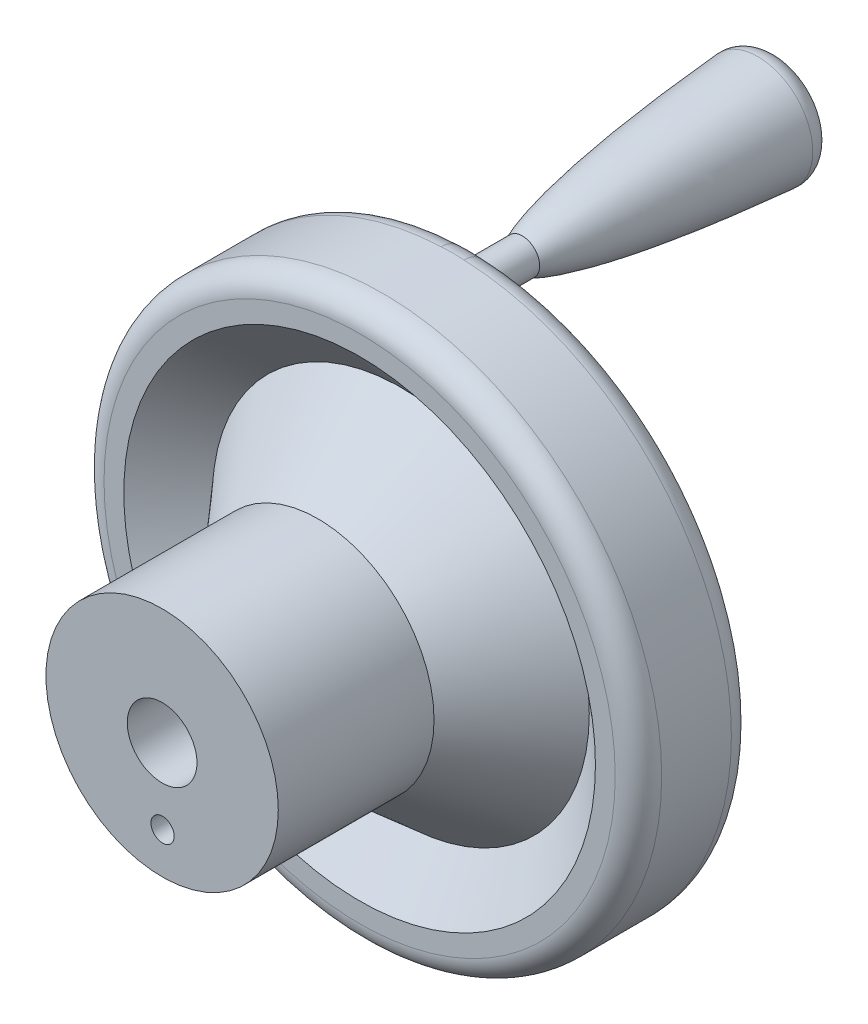
ISO-10303-21;
HEADER;
FILE_DESCRIPTION(('STEP AP214'),'2;1');
FILE_NAME('part.step','',(''),(''),'','','');
FILE_SCHEMA(('AUTOMOTIVE_DESIGN { 1 0 10303 214 1 1 1 1 }'));
ENDSEC;
DATA;
#1=APPLICATION_CONTEXT('core data for automotive mechanical design processes');
#2=APPLICATION_PROTOCOL_DEFINITION('international standard','automotive_design',2000,#1);
#3=PRODUCT_CONTEXT('',#1,'mechanical');
#4=PRODUCT('Part','Part','',(#3));
#5=PRODUCT_RELATED_PRODUCT_CATEGORY('part','',(#4));
#6=PRODUCT_DEFINITION_FORMATION('','',#4);
#7=PRODUCT_DEFINITION_CONTEXT('part definition',#1,'design');
#8=PRODUCT_DEFINITION('design','',#6,#7);
#9=PRODUCT_DEFINITION_SHAPE('','',#8);
#10=(LENGTH_UNIT() NAMED_UNIT(*) SI_UNIT(.MILLI.,.METRE.));
#11=(NAMED_UNIT(*) PLANE_ANGLE_UNIT() SI_UNIT($,.RADIAN.));
#12=(NAMED_UNIT(*) SI_UNIT($,.STERADIAN.) SOLID_ANGLE_UNIT());
#13=UNCERTAINTY_MEASURE_WITH_UNIT(LENGTH_MEASURE(1.E-05),#10,'distance_accuracy_value','');
#14=(GEOMETRIC_REPRESENTATION_CONTEXT(3) GLOBAL_UNCERTAINTY_ASSIGNED_CONTEXT((#13)) GLOBAL_UNIT_ASSIGNED_CONTEXT((#10,
#11,#12)) REPRESENTATION_CONTEXT('',''));
#15=CARTESIAN_POINT('',(0.,0.,0.));
#16=DIRECTION('',(0.,0.,1.));
#17=DIRECTION('',(1.,0.,0.));
#18=AXIS2_PLACEMENT_3D('',#15,#16,#17);
#19=CARTESIAN_POINT('',(0.,0.,-42.8625));
#20=DIRECTION('',(0.,0.,1.));
#21=DIRECTION('',(1.,0.,0.));
#22=AXIS2_PLACEMENT_3D('',#19,#20,#21);
#23=PLANE('',#22);
#24=CARTESIAN_POINT('',(0.,15.875,-42.8625));
#25=DIRECTION('',(0.,0.,1.));
#26=DIRECTION('',(1.,0.,0.));
#27=AXIS2_PLACEMENT_3D('',#24,#25,#26);
#28=CIRCLE('',#27,26.2316229134082);
#29=CARTESIAN_POINT('',(26.2316229134082,15.875,-42.8625));
#30=VERTEX_POINT('',#29);
#31=EDGE_CURVE('E155',#30,#30,#28,.T.);
#32=ORIENTED_EDGE('',*,*,#31,.T.);
#33=EDGE_LOOP('',(#32));
#34=FACE_BOUND('',#33,.T.);
#35=CARTESIAN_POINT('',(0.,48.8675413289895,-42.8625));
#36=DIRECTION('',(0.,0.,1.));
#37=DIRECTION('',(1.,0.,0.));
#38=AXIS2_PLACEMENT_3D('',#35,#36,#37);
#39=CIRCLE('',#38,2.38125);
#40=CARTESIAN_POINT('',(1.4312540513159,50.770660716493,-42.8625));
#41=VERTEX_POINT('',#40);
#42=CARTESIAN_POINT('',(-1.4312540513159,50.770660716493,-42.8625));
#43=VERTEX_POINT('',#42);
#44=EDGE_CURVE('E156',#41,#43,#39,.F.);
#45=ORIENTED_EDGE('',*,*,#44,.F.);
#46=CARTESIAN_POINT('',(0.,15.875,-42.8625));
#47=DIRECTION('',(0.,0.,1.));
#48=DIRECTION('',(1.,0.,0.));
#49=AXIS2_PLACEMENT_3D('',#46,#47,#48);
#50=CIRCLE('',#49,34.925);
#51=EDGE_CURVE('E65',#41,#43,#50,.F.);
#52=ORIENTED_EDGE('',*,*,#51,.T.);
#53=EDGE_LOOP('',(#45,#52));
#54=FACE_BOUND('',#53,.T.);
#55=ADVANCED_FACE('F37',(#34,#54),#23,.F.);
#56=CARTESIAN_POINT('',(0.,0.,-26.9875));
#57=DIRECTION('',(0.,0.,1.));
#58=DIRECTION('',(1.,0.,0.));
#59=AXIS2_PLACEMENT_3D('',#56,#57,#58);
#60=PLANE('',#59);
#61=CARTESIAN_POINT('',(0.,15.875,-26.9875));
#62=DIRECTION('',(0.,0.,1.));
#63=DIRECTION('',(1.,0.,0.));
#64=AXIS2_PLACEMENT_3D('',#61,#62,#63);
#65=CIRCLE('',#64,4.7625);
#66=CARTESIAN_POINT('',(4.7625,15.875,-26.9875));
#67=VERTEX_POINT('',#66);
#68=EDGE_CURVE('E81',#67,#67,#65,.T.);
#69=ORIENTED_EDGE('',*,*,#68,.T.);
#70=EDGE_LOOP('',(#69));
#71=FACE_BOUND('',#70,.T.);
#72=CARTESIAN_POINT('',(0.,15.875,-26.9875));
#73=DIRECTION('',(0.,0.,1.));
#74=DIRECTION('',(1.,0.,0.));
#75=AXIS2_PLACEMENT_3D('',#72,#73,#74);
#76=CIRCLE('',#75,10.976473748045);
#77=CARTESIAN_POINT('',(10.976473748045,15.875,-26.9875));
#78=VERTEX_POINT('',#77);
#79=EDGE_CURVE('E11',#78,#78,#76,.F.);
#80=ORIENTED_EDGE('',*,*,#79,.T.);
#81=EDGE_LOOP('',(#80));
#82=FACE_BOUND('',#81,.T.);
#83=ADVANCED_FACE('F146',(#71,#82),#60,.F.);
#84=CARTESIAN_POINT('',(0.,15.875,-26.9875));
#85=DIRECTION('',(0.,0.,-1.));
#86=DIRECTION('',(-1.,0.,0.));
#87=AXIS2_PLACEMENT_3D('',#84,#85,#86);
#88=CONICAL_SURFACE('',#87,12.4227923621973,0.715904360630924);
#89=CARTESIAN_POINT('',(0.,15.875,-28.0787474203081));
#90=DIRECTION('',(0.,0.,-1.));
#91=DIRECTION('',(-1.,0.,0.));
#92=AXIS2_PLACEMENT_3D('',#89,#90,#91);
#93=CIRCLE('',#92,13.3720113049677);
#94=CARTESIAN_POINT('',(-13.3720113049677,15.875,-28.0787474203081));
#95=VERTEX_POINT('',#94);
#96=EDGE_CURVE('E51',#95,#95,#93,.F.);
#97=ORIENTED_EDGE('',*,*,#96,.T.);
#98=EDGE_LOOP('',(#97));
#99=FACE_BOUND('',#98,.T.);
#100=ORIENTED_EDGE('',*,*,#31,.F.);
#101=EDGE_LOOP('',(#100));
#102=FACE_BOUND('',#101,.T.);
#103=ADVANCED_FACE('F109',(#99,#102),#88,.F.);
#104=CARTESIAN_POINT('',(0.,15.875,0.));
#105=DIRECTION('',(0.,0.,1.));
#106=DIRECTION('',(1.,0.,0.));
#107=AXIS2_PLACEMENT_3D('',#104,#105,#106);
#108=CYLINDRICAL_SURFACE('',#107,38.1);
#109=CARTESIAN_POINT('',(0.,15.875,-30.1625));
#110=DIRECTION('',(0.,0.,1.));
#111=DIRECTION('',(1.,0.,0.));
#112=AXIS2_PLACEMENT_3D('',#109,#110,#111);
#113=CIRCLE('',#112,38.1);
#114=CARTESIAN_POINT('',(38.1,15.875,-30.1625));
#115=VERTEX_POINT('',#114);
#116=EDGE_CURVE('E89',#115,#115,#113,.F.);
#117=ORIENTED_EDGE('',*,*,#116,.T.);
#118=EDGE_LOOP('',(#117));
#119=FACE_BOUND('',#118,.T.);
#120=CARTESIAN_POINT('',(0.,15.875,-39.6875));
#121=DIRECTION('',(0.,0.,1.));
#122=DIRECTION('',(1.,0.,0.));
#123=AXIS2_PLACEMENT_3D('',#120,#121,#122);
#124=CIRCLE('',#123,38.1);
#125=CARTESIAN_POINT('',(-1.56136805598098,53.9429935089014,-39.6875));
#126=VERTEX_POINT('',#125);
#127=CARTESIAN_POINT('',(1.56136805598098,53.9429935089014,-39.6875));
#128=VERTEX_POINT('',#127);
#129=EDGE_CURVE('E83',#126,#128,#124,.T.);
#130=ORIENTED_EDGE('',*,*,#129,.T.);
#131=CARTESIAN_POINT('',(-3.25893220723984,53.8353656577306,-39.8874009593512));
#132=CARTESIAN_POINT('',(-2.13464281321776,53.9318869333546,-43.6318650515733));
#133=CARTESIAN_POINT('',(-2.03826953040482,50.0987232342834,-42.8625));
#134=CARTESIAN_POINT('',(-3.18716892399169,53.8415274641934,-39.8674983802995));
#135=CARTESIAN_POINT('',(-2.13469227939795,53.9297477924333,-43.6028260363478));
#136=CARTESIAN_POINT('',(-2.02455389214637,50.1214033594115,-42.8625));
#137=CARTESIAN_POINT('',(-3.11484362194354,53.8475308333288,-39.8492925627205));
#138=CARTESIAN_POINT('',(-2.13195287407994,53.9280340597229,-43.5724021943916));
#139=CARTESIAN_POINT('',(-2.00980325708822,50.1449925775302,-42.8625));
#140=CARTESIAN_POINT('',(-2.96931171195949,53.8591874599694,-39.8161319750873));
#141=CARTESIAN_POINT('',(-2.12035962091838,53.9254321160298,-43.5095136314652));
#142=CARTESIAN_POINT('',(-1.97779778671117,50.1940186800199,-42.8625));
#143=CARTESIAN_POINT('',(-2.89610545554442,53.8648408519298,-39.8011759509051));
#144=CARTESIAN_POINT('',(-2.11156808955354,53.9245364186375,-43.4770828401394));
#145=CARTESIAN_POINT('',(-1.96054392171605,50.219454846561,-42.8625));
#146=CARTESIAN_POINT('',(-2.74944089573482,53.8757362384551,-39.7744379595531));
#147=CARTESIAN_POINT('',(-2.08755704890442,53.923512912985,-43.4108681036606));
#148=CARTESIAN_POINT('',(-1.92320048966037,50.2720631337033,-42.8625));
#149=CARTESIAN_POINT('',(-2.67598675582317,53.8809805026709,-39.762637444711));
#150=CARTESIAN_POINT('',(-2.07244425124496,53.9233734716274,-43.377124140032));
#151=CARTESIAN_POINT('',(-1.90312860037617,50.2992238944154,-42.8625));
#152=CARTESIAN_POINT('',(-2.52856866951647,53.8910728951716,-39.7418995502479));
#153=CARTESIAN_POINT('',(-2.03543092972666,53.9237705572811,-43.308639770496));
#154=CARTESIAN_POINT('',(-1.85954350014705,50.3553972398068,-42.8625));
#155=CARTESIAN_POINT('',(-2.45460467943081,53.8959209890382,-39.7329624191945));
#156=CARTESIAN_POINT('',(-2.01360414038793,53.9243003836069,-43.273922502129));
#157=CARTESIAN_POINT('',(-1.83602999069619,50.3844099849933,-42.8625));
#158=CARTESIAN_POINT('',(-2.3065669171285,53.90518843797,-39.7177480777698));
#159=CARTESIAN_POINT('',(-1.9629127655148,53.9259400770166,-43.2041789670085));
#160=CARTESIAN_POINT('',(-1.78504351356791,50.4440903527177,-42.8625));
#161=CARTESIAN_POINT('',(-2.23249423351478,53.9096091015865,-39.7114625372452));
#162=CARTESIAN_POINT('',(-1.93415138278179,53.9270419621918,-43.1691711664222));
#163=CARTESIAN_POINT('',(-1.75758331474038,50.4747524462146,-42.8625));
#164=CARTESIAN_POINT('',(-2.08413633041315,53.9180269064715,-39.701242547187));
#165=CARTESIAN_POINT('',(-1.86927782618067,53.9297181731531,-43.0993555099725));
#166=CARTESIAN_POINT('',(-1.69797927460575,50.5375994166213,-42.8625));
#167=CARTESIAN_POINT('',(-2.00985111248678,53.9220240508434,-39.6973080804236));
#168=CARTESIAN_POINT('',(-1.83324908580337,53.9312873289918,-43.0645546066681));
#169=CARTESIAN_POINT('',(-1.66583546762424,50.5697842823697,-42.8625));
#170=CARTESIAN_POINT('',(-1.86103356388052,53.9295938809826,-39.6914744906112));
#171=CARTESIAN_POINT('',(-1.75356356424931,53.9347827255551,-42.9957553617258));
#172=CARTESIAN_POINT('',(-1.5960783185992,50.6353595723395,-42.8625));
#173=CARTESIAN_POINT('',(-1.78650102903211,53.9331657908561,-39.6895790388724));
#174=CARTESIAN_POINT('',(-1.70997560956818,53.9367057563413,-42.9617537148788));
#175=CARTESIAN_POINT('',(-1.55845524874637,50.6687520595989,-42.8625));
#176=CARTESIAN_POINT('',(-1.63739380097811,53.9398724051658,-39.6874803998795));
#177=CARTESIAN_POINT('',(-1.61511736408651,53.9407773918726,-42.8953367150201));
#178=CARTESIAN_POINT('',(-1.47704407219363,50.7360921877226,-42.8625));
#179=CARTESIAN_POINT('',(-1.56281910922434,53.9430071238347,-39.6872771575227));
#180=CARTESIAN_POINT('',(-1.56392349740692,53.9429237772245,-42.8629039351989));
#181=CARTESIAN_POINT('',(-1.43325616628371,50.7700398104743,-42.8625));
#182=CARTESIAN_POINT('',(-1.41210515390373,53.9488987367196,-39.6881749264114));
#183=CARTESIAN_POINT('',(-1.45276782039159,53.9473497848573,-42.7997411450014));
#184=CARTESIAN_POINT('',(-1.33784844412265,50.8383343298695,-42.8625));
#185=CARTESIAN_POINT('',(-1.33596578192058,53.951646359833,-39.6893032989946));
#186=CARTESIAN_POINT('',(-1.39269645903124,53.9496314457823,-42.7690208313269));
#187=CARTESIAN_POINT('',(-1.28608400549859,50.8726747320622,-42.8625));
#188=CARTESIAN_POINT('',(-1.18369270130523,53.9566842490239,-39.6924496713417));
#189=CARTESIAN_POINT('',(-1.26488647517187,53.9541346924582,-42.710880137425));
#190=CARTESIAN_POINT('',(-1.17489149742961,50.9397852476356,-42.8625));
#191=CARTESIAN_POINT('',(-1.10755899306542,53.9589744951282,-39.6944677099439));
#192=CARTESIAN_POINT('',(-1.19718126398557,53.9563582125254,-42.6834109981914));
#193=CARTESIAN_POINT('',(-1.11546309349394,50.9725552923929,-42.8625));
#194=CARTESIAN_POINT('',(-0.955282935899552,53.9630983608487,-39.6989113395423));
#195=CARTESIAN_POINT('',(-1.05469070605597,53.9605938319484,-42.6326320410987));
#196=CARTESIAN_POINT('',(-0.988785186441124,51.0349441786686,-42.8625));
#197=CARTESIAN_POINT('',(-0.879140587391611,53.9649319118806,-39.7013369916606));
#198=CARTESIAN_POINT('',(-0.979893855654809,53.9626098183821,-42.6092619703113));
#199=CARTESIAN_POINT('',(-0.921534510834109,51.064562546501,-42.8625));
#200=CARTESIAN_POINT('',(-0.726844590691218,53.9681423999886,-39.7061187607355));
#201=CARTESIAN_POINT('',(-0.82420166687916,53.966286764944,-42.5675114984134));
#202=CARTESIAN_POINT('',(-0.779658166511808,51.1188175076494,-42.8625));
#203=CARTESIAN_POINT('',(-0.650690942677252,53.9695193436391,-39.7084748786928));
#204=CARTESIAN_POINT('',(-0.743239950975251,53.9679529219691,-42.5490651180309));
#205=CARTESIAN_POINT('',(-0.705032604000416,51.1434541726901,-42.8625));
#206=CARTESIAN_POINT('',(-0.498376878938621,53.9718164048679,-39.71268751989));
#207=CARTESIAN_POINT('',(-0.576623630723622,53.9708060438124,-42.5178859483779));
#208=CARTESIAN_POINT('',(-0.549627076263344,51.1858896164551,-42.8625));
#209=CARTESIAN_POINT('',(-0.422216468830213,53.972736627783,-39.7145441582831));
#210=CARTESIAN_POINT('',(-0.490842796384397,53.9719984155778,-42.5050913052859));
#211=CARTESIAN_POINT('',(-0.4688485351046,51.2036899716713,-42.8625));
#212=CARTESIAN_POINT('',(-0.269872493749272,53.9741203472122,-39.71742771225));
#213=CARTESIAN_POINT('',(-0.316348247537206,53.9738126918844,-42.4857450602891));
#214=CARTESIAN_POINT('',(-0.303138606509098,51.2309077786712,-42.8625));
#215=CARTESIAN_POINT('',(-0.193688929040989,53.9745838487563,-39.7184546369615));
#216=CARTESIAN_POINT('',(-0.227453572613235,53.9744386059491,-42.4791501370674));
#217=CARTESIAN_POINT('',(-0.218207264818705,51.2403253227762,-42.8625));
#218=CARTESIAN_POINT('',(-0.0413190832285973,53.9750537569059,-39.7194962046299));
#219=CARTESIAN_POINT('',(-0.0487902328594792,53.9750717733759,-42.4724793531334));
#220=CARTESIAN_POINT('',(-0.0468578181279424,51.2498752887837,-42.8625));
#221=CARTESIAN_POINT('',(0.0348671968844491,53.9750602081257,-39.7195109463893));
#222=CARTESIAN_POINT('',(0.0411912612327301,53.9750806077292,-42.4723868342849));
#223=CARTESIAN_POINT('',(0.039560140935088,51.250008616949,-42.8625));
#224=CARTESIAN_POINT('',(0.187230667823032,53.9746161201796,-39.7185257808931));
#225=CARTESIAN_POINT('',(0.219905696204176,53.9744820053112,-42.4786924129183));
#226=CARTESIAN_POINT('',(0.210982784583051,51.2409792642775,-42.8625));
#227=CARTESIAN_POINT('',(0.263407858581162,53.9741655778127,-39.7175258665303));
#228=CARTESIAN_POINT('',(0.308852017918497,53.9738731249234,-42.485105715947));
#229=CARTESIAN_POINT('',(0.295987459264242,51.2318165183253,-42.8625));
#230=CARTESIAN_POINT('',(0.415997113012835,53.972805549344,-39.7146842347338));
#231=CARTESIAN_POINT('',(0.483799411396764,53.9720878559481,-42.5041329367989));
#232=CARTESIAN_POINT('',(0.462193219332662,51.2050284092334,-42.8625));
#233=CARTESIAN_POINT('',(0.492409095852822,53.9718945099872,-39.7128396702921));
#234=CARTESIAN_POINT('',(0.569972181957507,53.9709055771155,-42.5168106860413));
#235=CARTESIAN_POINT('',(0.543380408558956,51.1873744149644,-42.8625));
#236=CARTESIAN_POINT('',(0.645208744311764,53.9696130590965,-39.7086385243373));
#237=CARTESIAN_POINT('',(0.737357043451127,53.9680670809004,-42.547806033493));
#238=CARTESIAN_POINT('',(0.699585463483091,51.1451468876325,-42.8625));
#239=CARTESIAN_POINT('',(0.721596409816212,53.9682426454305,-39.706281940448));
#240=CARTESIAN_POINT('',(0.818699292669247,53.9664055261362,-42.5661845199856));
#241=CARTESIAN_POINT('',(0.774603300546482,51.1205733224555,-42.8625));
#242=CARTESIAN_POINT('',(0.874348569448133,53.9650426579959,-39.701488988149));
#243=CARTESIAN_POINT('',(0.975125283407045,53.9627330027517,-42.6078430211048));
#244=CARTESIAN_POINT('',(0.917225631535846,51.0663764845255,-42.8625));
#245=CARTESIAN_POINT('',(0.950713065313226,53.9632131465424,-39.6990526306064));
#246=CARTESIAN_POINT('',(1.05027834509496,53.9607168251663,-42.6311888910079));
#247=CARTESIAN_POINT('',(0.984831129781004,51.0367538972721,-42.8625));
#248=CARTESIAN_POINT('',(1.1034465273274,53.9590943435682,-39.6945802435024));
#249=CARTESIAN_POINT('',(1.19346516023918,53.9564764685988,-42.6819634366925));
#250=CARTESIAN_POINT('',(1.11218604163182,50.9742994380033,-42.8625));
#251=CARTESIAN_POINT('',(1.17981549354067,53.9568050404347,-39.6925442240547));
#252=CARTESIAN_POINT('',(1.26151013868554,53.9542483008726,-42.7094537734888));
#253=CARTESIAN_POINT('',(1.17193525675066,50.9414674849406,-42.8625));
#254=CARTESIAN_POINT('',(1.33276424862301,53.9517594357784,-39.6893556619627));
#255=CARTESIAN_POINT('',(1.39013184803561,53.9497269817585,-42.7677484040182));
#256=CARTESIAN_POINT('',(1.28386582591734,50.8741111412855,-42.8625));
#257=CARTESIAN_POINT('',(1.40934406174605,53.9490019172014,-39.6882054661508));
#258=CARTESIAN_POINT('',(1.45065302280902,53.947431730594,-42.7986104108668));
#259=CARTESIAN_POINT('',(1.33602678206097,50.839582511036,-42.8625));
#260=CARTESIAN_POINT('',(1.5624898808155,53.9430246057238,-39.6872654464708));
#261=CARTESIAN_POINT('',(1.56377528344013,53.9429318963734,-42.8627501327822));
#262=CARTESIAN_POINT('',(1.43311935865754,50.7701918639345,-42.8625));
#263=CARTESIAN_POINT('',(1.63905588735274,53.9398048639111,-39.6874754723751));
#264=CARTESIAN_POINT('',(1.61631260615864,53.9407275612743,-42.8960621318553));
#265=CARTESIAN_POINT('',(1.4780517768933,50.7353298843235,-42.8625));
#266=CARTESIAN_POINT('',(1.79224660493523,53.9328997859484,-39.6896896177061));
#267=CARTESIAN_POINT('',(1.71351232223652,53.9365523720825,-42.9643483903672));
#268=CARTESIAN_POINT('',(1.56148696616171,50.6661693511029,-42.8625));
#269=CARTESIAN_POINT('',(1.8688712526191,53.9292138177361,-39.6916961955941));
#270=CARTESIAN_POINT('',(1.7580800001294,53.9345843234796,-42.9993428276889));
#271=CARTESIAN_POINT('',(1.5999808407828,50.6318716351675,-42.8625));
#272=CARTESIAN_POINT('',(2.02202301661667,53.921383694985,-39.6978829353397));
#273=CARTESIAN_POINT('',(1.83942363133127,53.9310169084658,-43.0702447246564));
#274=CARTESIAN_POINT('',(1.67128038806296,50.5644616908537,-42.8625));
#275=CARTESIAN_POINT('',(2.09855007799942,53.9172393473916,-39.7020640157936));
#276=CARTESIAN_POINT('',(1.87610601592775,53.9294219479848,-43.1061570132636));
#277=CARTESIAN_POINT('',(1.70408364896485,50.5313499698102,-42.8625));
#278=CARTESIAN_POINT('',(2.1749702951139,53.9128693437917,-39.707519781938));
#279=CARTESIAN_POINT('',(1.90876976573539,53.9280904446034,-43.1419233131628));
#280=CARTESIAN_POINT('',(1.7344340235946,50.4991326320729,-42.8625));
#281=(BOUNDED_SURFACE() B_SPLINE_SURFACE(3,2,((#131,#132,#133),(#134,#135,#136),(#137,#138,
#139),(#140,#141,#142),(#143,#144,#145),(#146,#147,#148),(#149,#150,#151),(#152,#153,#154),
(#155,#156,#157),(#158,#159,#160),(#161,#162,#163),(#164,#165,#166),(#167,#168,#169),(#170,#171,
#172),(#173,#174,#175),(#176,#177,#178),(#179,#180,#181),(#182,#183,#184),(#185,#186,#187),
(#188,#189,#190),(#191,#192,#193),(#194,#195,#196),(#197,#198,#199),(#200,#201,#202),(#203,#204,
#205),(#206,#207,#208),(#209,#210,#211),(#212,#213,#214),(#215,#216,#217),(#218,#219,#220),
(#221,#222,#223),(#224,#225,#226),(#227,#228,#229),(#230,#231,#232),(#233,#234,#235),(#236,#237,
#238),(#239,#240,#241),(#242,#243,#244),(#245,#246,#247),(#248,#249,#250),(#251,#252,#253),
(#254,#255,#256),(#257,#258,#259),(#260,#261,#262),(#263,#264,#265),(#266,#267,#268),(#269,#270,
#271),(#272,#273,#274),(#275,#276,#277),(#278,#279,#280)),.UNSPECIFIED.,.F.,.F.,
.F.) B_SPLINE_SURFACE_WITH_KNOTS((4,2,2,2,2,2,2,2,2,2,2,2,2,2,2,2,2,2,2,2,2,2,2,2,4),(3,3),(0.,
0.206841073136162,0.413602181898635,0.61911984138152,0.824655336835932,1.02954023117617,
1.2344236240152,1.43967530152098,1.64492029548307,1.85445704540396,2.0640029435706,
2.27358029140225,2.48315462160284,2.69268059371095,2.90220425824547,3.11170747045448,
3.32121215016142,3.53142825173328,3.74164532894773,3.95183388795265,4.16202775629359,
4.3727765983812,4.58350216503944,4.79451653703106,5.00562012236643),(0.,1.),
.UNSPECIFIED.) GEOMETRIC_REPRESENTATION_ITEM() RATIONAL_B_SPLINE_SURFACE(((1.,0.630290673707332,
1.),(1.,0.633179096560126,1.),(1.,0.63613893487542,1.),(1.,0.642198715396573,1.),(1.,
0.645298602996157,1.),(1.,0.651618928440305,1.),(1.,0.654838529187535,1.),(1.,0.661408382393507,
1.),(1.,0.664758646166686,1.),(1.,0.671563577658291,1.),(1.,0.675017881328215,1.),(1.,
0.682014736279481,1.),(1.,0.685557286913914,1.),(1.,0.692695868336793,1.),(1.,0.69629198381116,
1.),(1.,0.703470328291863,1.),(1.,0.707052557746567,1.),(1.,0.714192486633135,1.),(1.,
0.717748106820226,1.),(1.,0.72463863103705,1.),(1.,0.727973525423673,1.),(1.,0.734277486852042,
1.),(1.,0.737246498913524,1.),(1.,0.742654483193473,1.),(1.,0.745093463043183,1.),(1.,
0.749277964412472,1.),(1.,0.751023645813784,1.),(1.,0.753687467020654,1.),(1.,0.754605615939968,
1.),(1.,0.755536648672947,1.),(1.,0.755549620843905,1.),(1.,0.754669391019159,1.),(1.,
0.753776182676017,1.),(1.,0.75115484001153,1.),(1.,0.749423880804429,1.),(1.,0.745260836190246,
1.),(1.,0.742828747529173,1.),(1.,0.737428006982723,1.),(1.,0.734459427932681,1.),(1.,
0.728150625852614,1.),(1.,0.724810393436804,1.),(1.,0.717896507098299,1.),(1.,0.71432226015933,
1.),(1.,0.707069152797727,1.),(1.,0.703390303972366,1.),(1.,0.696015374761661,1.),(1.,
0.692319277670133,1.),(1.,0.684974292178182,1.),(1.,0.681325424397463,1.),(1.,0.677731484282897,1.))) REPRESENTATION_ITEM('') SURFACE());
#282=CARTESIAN_POINT('',(2.1749702951139,53.9128693437917,-39.707519781938));
#283=CARTESIAN_POINT('',(2.09855007799942,53.9172393473916,-39.7020640157936));
#284=CARTESIAN_POINT('',(2.02202301661667,53.9213836949849,-39.6978829353397));
#285=CARTESIAN_POINT('',(1.8688712526191,53.9292138177361,-39.6916961955941));
#286=CARTESIAN_POINT('',(1.79224660493523,53.9328997859484,-39.6896896177061));
#287=CARTESIAN_POINT('',(1.63905588735274,53.9398048639111,-39.6874754723751));
#288=CARTESIAN_POINT('',(1.5624898808155,53.9430246057238,-39.6872654464708));
#289=CARTESIAN_POINT('',(1.40934406174605,53.9490019172014,-39.6882054661508));
#290=CARTESIAN_POINT('',(1.33276424862301,53.9517594357784,-39.6893556619627));
#291=CARTESIAN_POINT('',(1.17981549354067,53.9568050404347,-39.6925442240547));
#292=CARTESIAN_POINT('',(1.1034465273274,53.9590943435682,-39.6945802435024));
#293=CARTESIAN_POINT('',(0.950713065313226,53.9632131465424,-39.6990526306064));
#294=CARTESIAN_POINT('',(0.874348569448133,53.9650426579959,-39.701488988149));
#295=CARTESIAN_POINT('',(0.721596409816212,53.9682426454305,-39.706281940448));
#296=CARTESIAN_POINT('',(0.645208744311763,53.9696130590965,-39.7086385243373));
#297=CARTESIAN_POINT('',(0.492409095852822,53.9718945099872,-39.7128396702921));
#298=CARTESIAN_POINT('',(0.415997113012835,53.972805549344,-39.7146842347338));
#299=CARTESIAN_POINT('',(0.263407858581162,53.9741655778127,-39.7175258665303));
#300=CARTESIAN_POINT('',(0.187230667823032,53.9746161201796,-39.7185257808931));
#301=CARTESIAN_POINT('',(0.0348671968844491,53.9750602081257,-39.7195109463893));
#302=CARTESIAN_POINT('',(-0.0413190832285972,53.9750537569059,-39.7194962046299));
#303=CARTESIAN_POINT('',(-0.193688929040989,53.9745838487563,-39.7184546369615));
#304=CARTESIAN_POINT('',(-0.269872493749272,53.9741203472122,-39.71742771225));
#305=CARTESIAN_POINT('',(-0.422216468830213,53.972736627783,-39.7145441582831));
#306=CARTESIAN_POINT('',(-0.498376878938621,53.9718164048679,-39.71268751989));
#307=CARTESIAN_POINT('',(-0.650690942677252,53.9695193436391,-39.7084748786928));
#308=CARTESIAN_POINT('',(-0.726844590691218,53.9681423999886,-39.7061187607355));
#309=CARTESIAN_POINT('',(-0.879140587391611,53.9649319118806,-39.7013369916606));
#310=CARTESIAN_POINT('',(-0.955282935899552,53.9630983608487,-39.6989113395424));
#311=CARTESIAN_POINT('',(-1.10755899306542,53.9589744951283,-39.6944677099439));
#312=CARTESIAN_POINT('',(-1.18369270130523,53.9566842490239,-39.6924496713417));
#313=CARTESIAN_POINT('',(-1.33596578192058,53.951646359833,-39.6893032989946));
#314=CARTESIAN_POINT('',(-1.41210515390373,53.9488987367196,-39.6881749264114));
#315=CARTESIAN_POINT('',(-1.56281910922434,53.9430071238347,-39.6872771575227));
#316=CARTESIAN_POINT('',(-1.63739380097811,53.9398724051658,-39.6874803998795));
#317=CARTESIAN_POINT('',(-1.78650102903211,53.9331657908561,-39.6895790388724));
#318=CARTESIAN_POINT('',(-1.86103356388052,53.9295938809826,-39.6914744906112));
#319=CARTESIAN_POINT('',(-2.00985111248678,53.9220240508434,-39.6973080804236));
#320=CARTESIAN_POINT('',(-2.08413633041315,53.9180269064715,-39.701242547187));
#321=CARTESIAN_POINT('',(-2.23249423351478,53.9096091015865,-39.7114625372452));
#322=CARTESIAN_POINT('',(-2.3065669171285,53.90518843797,-39.7177480777698));
#323=CARTESIAN_POINT('',(-2.45460467943081,53.8959209890382,-39.7329624191945));
#324=CARTESIAN_POINT('',(-2.52856866951647,53.8910728951716,-39.7418995502479));
#325=CARTESIAN_POINT('',(-2.67598675582317,53.8809805026709,-39.762637444711));
#326=CARTESIAN_POINT('',(-2.74944089573482,53.8757362384551,-39.7744379595531));
#327=CARTESIAN_POINT('',(-2.89610545554442,53.8648408519298,-39.8011759509051));
#328=CARTESIAN_POINT('',(-2.96931171195949,53.8591874599694,-39.8161319750873));
#329=CARTESIAN_POINT('',(-3.11484362194353,53.8475308333288,-39.8492925627205));
#330=CARTESIAN_POINT('',(-3.18716892399169,53.8415274641934,-39.8674983802995));
#331=CARTESIAN_POINT('',(-3.25893220723984,53.8353656577306,-39.8874009593512));
#332=B_SPLINE_CURVE_WITH_KNOTS('',3,(#282,#283,#284,#285,#286,#287,#288,#289,#290,#291,#292,
#293,#294,#295,#296,#297,#298,#299,#300,#301,#302,#303,#304,#305,#306,#307,#308,#309,#310,#311,
#312,#313,#314,#315,#316,#317,#318,#319,#320,#321,#322,#323,#324,#325,#326,#327,#328,#329,#330,
#331),.UNSPECIFIED.,.F.,.F.,(4,2,2,2,2,2,2,2,2,2,2,2,2,2,2,2,2,2,2,2,2,2,2,2,4),(0.,
0.211103585335369,0.42211795732699,0.632843523985229,0.843592366072841,1.05378623441378,
1.2639747934187,1.47419187063315,1.68440797220501,1.89391265191196,2.10341586412096,
2.31293952865548,2.52246550076359,2.73203983096418,2.94161717879583,3.15116307696247,
3.36069982688336,3.56594482084545,3.77119649835123,3.97607989119026,4.1809647855305,
4.38650028098491,4.5920179404678,4.79877904923027,5.00562012236643),.UNSPECIFIED.);
#333=EDGE_CURVE('E77',#128,#126,#332,.T.);
#334=ORIENTED_EDGE('',*,*,#333,.T.);
#335=EDGE_LOOP('',(#130,#334));
#336=FACE_BOUND('',#335,.T.);
#337=ADVANCED_FACE('F88',(#119,#336),#108,.T.);
#338=CARTESIAN_POINT('',(0.,0.,-26.9875));
#339=DIRECTION('',(0.,0.,1.));
#340=DIRECTION('',(1.,0.,0.));
#341=AXIS2_PLACEMENT_3D('',#338,#339,#340);
#342=PLANE('',#341);
#343=CARTESIAN_POINT('',(0.,15.875,-26.9875));
#344=DIRECTION('',(0.,0.,1.));
#345=DIRECTION('',(1.,0.,0.));
#346=AXIS2_PLACEMENT_3D('',#343,#344,#345);
#347=CIRCLE('',#346,34.925);
#348=CARTESIAN_POINT('',(34.925,15.875,-26.9875));
#349=VERTEX_POINT('',#348);
#350=EDGE_CURVE('E86',#349,#349,#347,.T.);
#351=ORIENTED_EDGE('',*,*,#350,.T.);
#352=EDGE_LOOP('',(#351));
#353=FACE_BOUND('',#352,.T.);
#354=CARTESIAN_POINT('',(0.,15.875,-26.9875));
#355=DIRECTION('',(0.,0.,1.));
#356=DIRECTION('',(1.,0.,0.));
#357=AXIS2_PLACEMENT_3D('',#354,#355,#356);
#358=CIRCLE('',#357,32.2236222707739);
#359=CARTESIAN_POINT('',(32.2236222707739,15.875,-26.9875));
#360=VERTEX_POINT('',#359);
#361=EDGE_CURVE('E333',#360,#360,#358,.T.);
#362=ORIENTED_EDGE('',*,*,#361,.F.);
#363=EDGE_LOOP('',(#362));
#364=FACE_BOUND('',#363,.T.);
#365=ADVANCED_FACE('F108',(#353,#364),#342,.T.);
#366=CARTESIAN_POINT('',(0.,15.875,-32.6249377313451));
#367=DIRECTION('',(0.,0.,1.));
#368=DIRECTION('',(1.,0.,0.));
#369=AXIS2_PLACEMENT_3D('',#366,#367,#368);
#370=CONICAL_SURFACE('',#369,25.7426734566649,0.854891966163971);
#371=ORIENTED_EDGE('',*,*,#361,.T.);
#372=EDGE_LOOP('',(#371));
#373=FACE_BOUND('',#372,.T.);
#374=CARTESIAN_POINT('',(0.,15.875,-32.6249377313451));
#375=DIRECTION('',(0.,0.,1.));
#376=DIRECTION('',(1.,0.,0.));
#377=AXIS2_PLACEMENT_3D('',#374,#375,#376);
#378=CIRCLE('',#377,25.7426734566649);
#379=CARTESIAN_POINT('',(25.7426734566649,15.875,-32.6249377313451));
#380=VERTEX_POINT('',#379);
#381=EDGE_CURVE('E331',#380,#380,#378,.T.);
#382=ORIENTED_EDGE('',*,*,#381,.F.);
#383=EDGE_LOOP('',(#382));
#384=FACE_BOUND('',#383,.T.);
#385=ADVANCED_FACE('F205',(#373,#384),#370,.F.);
#386=CARTESIAN_POINT('',(0.,15.875,-21.2807970712356));
#387=DIRECTION('',(0.,0.,-1.));
#388=DIRECTION('',(-1.,0.,0.));
#389=AXIS2_PLACEMENT_3D('',#386,#387,#388);
#390=CONICAL_SURFACE('',#389,15.875,0.715904360630925);
#391=ORIENTED_EDGE('',*,*,#381,.T.);
#392=EDGE_LOOP('',(#391));
#393=FACE_BOUND('',#392,.T.);
#394=CARTESIAN_POINT('',(0.,15.875,-21.2807970712356));
#395=DIRECTION('',(0.,0.,1.));
#396=DIRECTION('',(1.,0.,0.));
#397=AXIS2_PLACEMENT_3D('',#394,#395,#396);
#398=CIRCLE('',#397,15.875);
#399=CARTESIAN_POINT('',(15.875,15.875,-21.2807970712356));
#400=VERTEX_POINT('',#399);
#401=EDGE_CURVE('E328',#400,#400,#398,.T.);
#402=ORIENTED_EDGE('',*,*,#401,.F.);
#403=EDGE_LOOP('',(#402));
#404=FACE_BOUND('',#403,.T.);
#405=ADVANCED_FACE('F212',(#393,#404),#390,.T.);
#406=CARTESIAN_POINT('',(0.,15.875,0.));
#407=DIRECTION('',(0.,0.,1.));
#408=DIRECTION('',(1.,0.,0.));
#409=AXIS2_PLACEMENT_3D('',#406,#407,#408);
#410=CYLINDRICAL_SURFACE('',#409,15.875);
#411=ORIENTED_EDGE('',*,*,#401,.T.);
#412=EDGE_LOOP('',(#411));
#413=FACE_BOUND('',#412,.T.);
#414=CARTESIAN_POINT('',(0.,15.875,0.));
#415=DIRECTION('',(0.,0.,1.));
#416=DIRECTION('',(1.,0.,0.));
#417=AXIS2_PLACEMENT_3D('',#414,#415,#416);
#418=CIRCLE('',#417,15.875);
#419=CARTESIAN_POINT('',(15.875,15.875,0.));
#420=VERTEX_POINT('',#419);
#421=EDGE_CURVE('E325',#420,#420,#418,.T.);
#422=ORIENTED_EDGE('',*,*,#421,.F.);
#423=EDGE_LOOP('',(#422));
#424=FACE_BOUND('',#423,.T.);
#425=ADVANCED_FACE('F219',(#413,#424),#410,.T.);
#426=CARTESIAN_POINT('',(0.,0.,0.));
#427=DIRECTION('',(0.,0.,1.));
#428=DIRECTION('',(1.,0.,0.));
#429=AXIS2_PLACEMENT_3D('',#426,#427,#428);
#430=PLANE('',#429);
#431=CARTESIAN_POINT('',(0.0635000000000011,5.61975,0.));
#432=DIRECTION('',(0.,0.,1.));
#433=DIRECTION('',(1.,0.,0.));
#434=AXIS2_PLACEMENT_3D('',#431,#432,#433);
#435=CIRCLE('',#434,1.58749999999999);
#436=CARTESIAN_POINT('',(1.65099999999999,5.61975,0.));
#437=VERTEX_POINT('',#436);
#438=EDGE_CURVE('E352',#437,#437,#435,.T.);
#439=ORIENTED_EDGE('',*,*,#438,.F.);
#440=EDGE_LOOP('',(#439));
#441=FACE_BOUND('',#440,.T.);
#442=CARTESIAN_POINT('',(0.,15.875,0.));
#443=DIRECTION('',(0.,0.,1.));
#444=DIRECTION('',(1.,0.,0.));
#445=AXIS2_PLACEMENT_3D('',#442,#443,#444);
#446=CIRCLE('',#445,4.7625);
#447=CARTESIAN_POINT('',(4.7625,15.875,0.));
#448=VERTEX_POINT('',#447);
#449=EDGE_CURVE('E346',#448,#448,#446,.T.);
#450=ORIENTED_EDGE('',*,*,#449,.F.);
#451=EDGE_LOOP('',(#450));
#452=FACE_BOUND('',#451,.T.);
#453=ORIENTED_EDGE('',*,*,#421,.T.);
#454=EDGE_LOOP('',(#453));
#455=FACE_BOUND('',#454,.T.);
#456=ADVANCED_FACE('F227',(#441,#452,#455),#430,.T.);
#457=CARTESIAN_POINT('',(0.,48.8675413289895,-49.2125));
#458=DIRECTION('',(0.,0.,1.));
#459=DIRECTION('',(1.,0.,0.));
#460=AXIS2_PLACEMENT_3D('',#457,#458,#459);
#461=CYLINDRICAL_SURFACE('',#460,2.38125);
#462=CARTESIAN_POINT('',(0.,48.8675413289895,-49.2125));
#463=DIRECTION('',(0.,0.,-1.));
#464=DIRECTION('',(-1.,0.,0.));
#465=AXIS2_PLACEMENT_3D('',#462,#463,#464);
#466=CIRCLE('',#465,2.38125);
#467=CARTESIAN_POINT('',(-2.38125,48.8675413289895,-49.2125));
#468=VERTEX_POINT('',#467);
#469=EDGE_CURVE('E128',#468,#468,#466,.T.);
#470=ORIENTED_EDGE('',*,*,#469,.F.);
#471=EDGE_LOOP('',(#470));
#472=FACE_BOUND('',#471,.T.);
#473=EDGE_CURVE('E79',#43,#41,#39,.F.);
#474=ORIENTED_EDGE('',*,*,#473,.T.);
#475=ORIENTED_EDGE('',*,*,#44,.T.);
#476=EDGE_LOOP('',(#474,#475));
#477=FACE_BOUND('',#476,.T.);
#478=ADVANCED_FACE('F122',(#472,#477),#461,.T.);
#479=CARTESIAN_POINT('',(0.,0.,-84.1375));
#480=DIRECTION('',(0.,0.,-1.));
#481=DIRECTION('',(-1.,0.,0.));
#482=AXIS2_PLACEMENT_3D('',#479,#480,#481);
#483=PLANE('',#482);
#484=CARTESIAN_POINT('',(0.,48.8675413289895,-84.1375));
#485=DIRECTION('',(0.,0.,-1.));
#486=DIRECTION('',(-1.,0.,0.));
#487=AXIS2_PLACEMENT_3D('',#484,#485,#486);
#488=CIRCLE('',#487,4.96198096071545);
#489=CARTESIAN_POINT('',(-4.96198096071545,48.8675413289895,-84.1375));
#490=VERTEX_POINT('',#489);
#491=EDGE_CURVE('E161',#490,#490,#488,.T.);
#492=ORIENTED_EDGE('',*,*,#491,.T.);
#493=EDGE_LOOP('',(#492));
#494=FACE_BOUND('',#493,.T.);
#495=ADVANCED_FACE('F185',(#494),#483,.T.);
#496=CARTESIAN_POINT('',(0.,48.8675413289895,-122.268229717792));
#497=DIRECTION('',(1.,0.,0.));
#498=DIRECTION('',(0.,0.,1.));
#499=AXIS2_PLACEMENT_3D('',#496,#497,#498);
#500=ELLIPSE('',#499,75.8216649560134,8.89739611870944);
#501=TRIMMED_CURVE('',#500,(PARAMETER_VALUE(3.14159265358979)),
(PARAMETER_VALUE(6.28318530717959)),.T.,.PARAMETER.);
#502=CARTESIAN_POINT('',(0.,48.8675413289895,-49.2125));
#503=DIRECTION('',(0.,0.,1.));
#504=AXIS1_PLACEMENT('',#502,#503);
#505=SURFACE_OF_REVOLUTION('',#501,#504);
#506=CARTESIAN_POINT('',(0.,48.8675413289895,-81.4073496575074));
#507=DIRECTION('',(0.,0.,1.));
#508=DIRECTION('',(1.,0.,0.));
#509=AXIS2_PLACEMENT_3D('',#506,#507,#508);
#510=CIRCLE('',#509,7.4948534105735);
#511=CARTESIAN_POINT('',(7.4948534105735,48.8675413289895,-81.4073496575074));
#512=VERTEX_POINT('',#511);
#513=EDGE_CURVE('E159',#512,#512,#510,.T.);
#514=ORIENTED_EDGE('',*,*,#513,.T.);
#515=EDGE_LOOP('',(#514));
#516=FACE_BOUND('',#515,.T.);
#517=ORIENTED_EDGE('',*,*,#469,.T.);
#518=EDGE_LOOP('',(#517));
#519=FACE_BOUND('',#518,.T.);
#520=ADVANCED_FACE('F179',(#516,#519),#505,.T.);
#521=CARTESIAN_POINT('',(0.,48.8675413289895,-81.5975));
#522=DIRECTION('',(0.,0.,1.));
#523=DIRECTION('',(1.,0.,0.));
#524=AXIS2_PLACEMENT_3D('',#521,#522,#523);
#525=TOROIDAL_SURFACE('',#524,4.96198096071545,2.54);
#526=ORIENTED_EDGE('',*,*,#491,.F.);
#527=EDGE_LOOP('',(#526));
#528=FACE_BOUND('',#527,.T.);
#529=ORIENTED_EDGE('',*,*,#513,.F.);
#530=EDGE_LOOP('',(#529));
#531=FACE_BOUND('',#530,.T.);
#532=ADVANCED_FACE('F173',(#528,#531),#525,.T.);
#533=CARTESIAN_POINT('',(0.,15.875,-30.1625));
#534=DIRECTION('',(0.,0.,1.));
#535=DIRECTION('',(1.,0.,0.));
#536=AXIS2_PLACEMENT_3D('',#533,#534,#535);
#537=TOROIDAL_SURFACE('',#536,34.925,3.175);
#538=ORIENTED_EDGE('',*,*,#116,.F.);
#539=EDGE_LOOP('',(#538));
#540=FACE_BOUND('',#539,.T.);
#541=ORIENTED_EDGE('',*,*,#350,.F.);
#542=EDGE_LOOP('',(#541));
#543=FACE_BOUND('',#542,.T.);
#544=ADVANCED_FACE('F118',(#540,#543),#537,.T.);
#545=CARTESIAN_POINT('',(0.,15.875,-39.6875));
#546=DIRECTION('',(0.,0.,1.));
#547=DIRECTION('',(1.,0.,0.));
#548=AXIS2_PLACEMENT_3D('',#545,#546,#547);
#549=TOROIDAL_SURFACE('',#548,34.925,3.175);
#550=CARTESIAN_POINT('',(-1.4312540513159,50.770660716493,-39.6875));
#551=DIRECTION('',(0.999159934616836,0.040980788870892,0.));
#552=DIRECTION('',(-0.040980788870892,0.999159934616836,0.));
#553=AXIS2_PLACEMENT_3D('',#550,#551,#552);
#554=CIRCLE('',#553,3.175);
#555=EDGE_CURVE('E73',#43,#126,#554,.T.);
#556=ORIENTED_EDGE('',*,*,#555,.F.);
#557=ORIENTED_EDGE('',*,*,#51,.F.);
#558=CARTESIAN_POINT('',(1.4312540513159,50.770660716493,-39.6875));
#559=DIRECTION('',(-0.999159934616836,0.040980788870892,0.));
#560=DIRECTION('',(-0.040980788870892,-0.999159934616836,0.));
#561=AXIS2_PLACEMENT_3D('',#558,#559,#560);
#562=CIRCLE('',#561,3.175);
#563=EDGE_CURVE('E59',#128,#41,#562,.T.);
#564=ORIENTED_EDGE('',*,*,#563,.F.);
#565=ORIENTED_EDGE('',*,*,#129,.F.);
#566=EDGE_LOOP('',(#556,#557,#564,#565));
#567=FACE_BOUND('',#566,.T.);
#568=ADVANCED_FACE('F84',(#567),#549,.T.);
#569=ORIENTED_EDGE('',*,*,#563,.T.);
#570=ORIENTED_EDGE('',*,*,#473,.F.);
#571=ORIENTED_EDGE('',*,*,#555,.T.);
#572=ORIENTED_EDGE('',*,*,#333,.F.);
#573=EDGE_LOOP('',(#569,#570,#571,#572));
#574=FACE_BOUND('',#573,.T.);
#575=ADVANCED_FACE('F75',(#574),#281,.T.);
#576=CARTESIAN_POINT('',(0.,15.875,-30.1625));
#577=DIRECTION('',(0.,0.,1.));
#578=DIRECTION('',(1.,0.,0.));
#579=AXIS2_PLACEMENT_3D('',#576,#577,#578);
#580=TOROIDAL_SURFACE('',#579,10.976473748045,3.175);
#581=ORIENTED_EDGE('',*,*,#79,.F.);
#582=EDGE_LOOP('',(#581));
#583=FACE_BOUND('',#582,.T.);
#584=ORIENTED_EDGE('',*,*,#96,.F.);
#585=EDGE_LOOP('',(#584));
#586=FACE_BOUND('',#585,.T.);
#587=ADVANCED_FACE('F39',(#583,#586),#580,.F.);
#588=CARTESIAN_POINT('',(0.,15.875,-84.1375));
#589=DIRECTION('',(0.,0.,1.));
#590=DIRECTION('',(1.,0.,0.));
#591=AXIS2_PLACEMENT_3D('',#588,#589,#590);
#592=CYLINDRICAL_SURFACE('',#591,4.7625);
#593=ORIENTED_EDGE('',*,*,#449,.T.);
#594=EDGE_LOOP('',(#593));
#595=FACE_BOUND('',#594,.T.);
#596=ORIENTED_EDGE('',*,*,#68,.F.);
#597=EDGE_LOOP('',(#596));
#598=FACE_BOUND('',#597,.T.);
#599=ADVANCED_FACE('F136',(#595,#598),#592,.F.);
#600=CARTESIAN_POINT('',(0.0634999999999979,5.61975,-12.7));
#601=DIRECTION('',(0.,0.,-1.));
#602=DIRECTION('',(-1.,0.,0.));
#603=AXIS2_PLACEMENT_3D('',#600,#601,#602);
#604=PLANE('',#603);
#605=CARTESIAN_POINT('',(0.0635000000000011,5.61975,-12.7));
#606=DIRECTION('',(0.,0.,1.));
#607=DIRECTION('',(1.,0.,0.));
#608=AXIS2_PLACEMENT_3D('',#605,#606,#607);
#609=CIRCLE('',#608,1.5875);
#610=CARTESIAN_POINT('',(1.651,5.61975,-12.7));
#611=VERTEX_POINT('',#610);
#612=EDGE_CURVE('E349',#611,#611,#609,.T.);
#613=ORIENTED_EDGE('',*,*,#612,.T.);
#614=EDGE_LOOP('',(#613));
#615=FACE_BOUND('',#614,.T.);
#616=ADVANCED_FACE('F141',(#615),#604,.F.);
#617=CARTESIAN_POINT('',(0.0635000000000011,5.61975,0.));
#618=DIRECTION('',(0.,0.,1.));
#619=DIRECTION('',(1.,0.,0.));
#620=AXIS2_PLACEMENT_3D('',#617,#618,#619);
#621=CYLINDRICAL_SURFACE('',#620,1.58749999999999);
#622=ORIENTED_EDGE('',*,*,#612,.F.);
#623=EDGE_LOOP('',(#622));
#624=FACE_BOUND('',#623,.T.);
#625=ORIENTED_EDGE('',*,*,#438,.T.);
#626=EDGE_LOOP('',(#625));
#627=FACE_BOUND('',#626,.T.);
#628=ADVANCED_FACE('F302',(#624,#627),#621,.F.);
#629=CLOSED_SHELL('',(#55,#83,#103,#337,#365,#385,#405,#425,#456,#478,#495,#520,#532,#544,#568,
#575,#587,#599,#616,#628));
#630=MANIFOLD_SOLID_BREP('B2',#629);
#631=ADVANCED_BREP_SHAPE_REPRESENTATION('',(#18,#630),#14);
#632=SHAPE_DEFINITION_REPRESENTATION(#9,#631);
ENDSEC;
END-ISO-10303-21;
